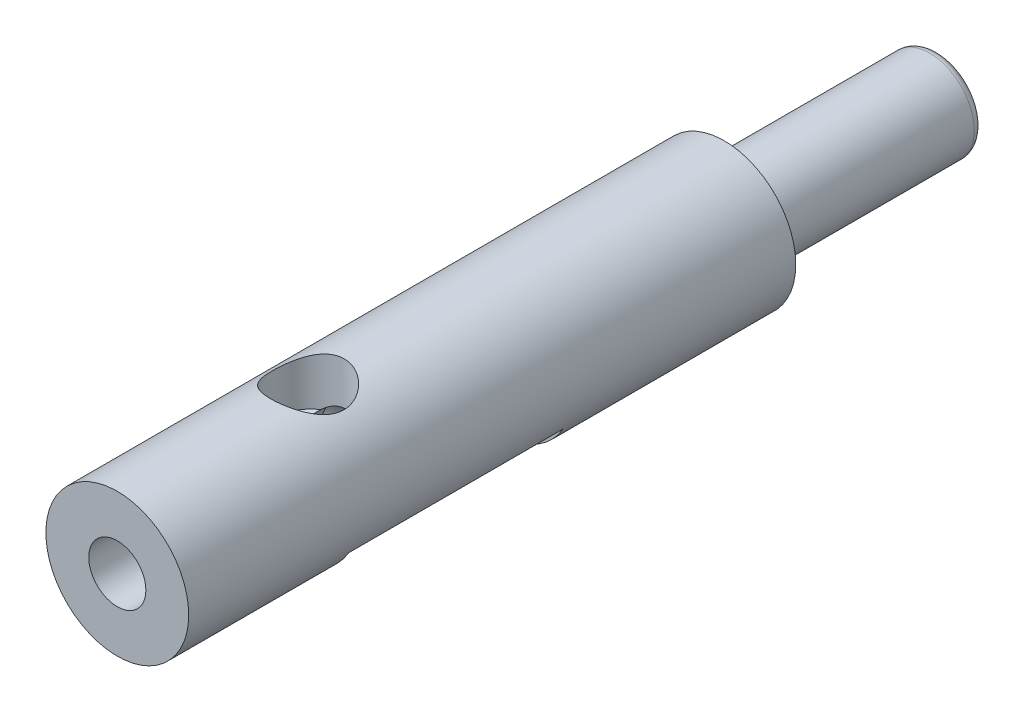
ISO-10303-21;
HEADER;
FILE_DESCRIPTION(('STEP AP214'),'2;1');
FILE_NAME('part.step','',(''),(''),'','','');
FILE_SCHEMA(('AUTOMOTIVE_DESIGN { 1 0 10303 214 1 1 1 1 }'));
ENDSEC;
DATA;
#1=APPLICATION_CONTEXT('core data for automotive mechanical design processes');
#2=APPLICATION_PROTOCOL_DEFINITION('international standard','automotive_design',2000,#1);
#3=PRODUCT_CONTEXT('',#1,'mechanical');
#4=PRODUCT('Part','Part','',(#3));
#5=PRODUCT_RELATED_PRODUCT_CATEGORY('part','',(#4));
#6=PRODUCT_DEFINITION_FORMATION('','',#4);
#7=PRODUCT_DEFINITION_CONTEXT('part definition',#1,'design');
#8=PRODUCT_DEFINITION('design','',#6,#7);
#9=PRODUCT_DEFINITION_SHAPE('','',#8);
#10=(LENGTH_UNIT() NAMED_UNIT(*) SI_UNIT(.MILLI.,.METRE.));
#11=(NAMED_UNIT(*) PLANE_ANGLE_UNIT() SI_UNIT($,.RADIAN.));
#12=(NAMED_UNIT(*) SI_UNIT($,.STERADIAN.) SOLID_ANGLE_UNIT());
#13=UNCERTAINTY_MEASURE_WITH_UNIT(LENGTH_MEASURE(1.E-05),#10,'distance_accuracy_value','');
#14=(GEOMETRIC_REPRESENTATION_CONTEXT(3) GLOBAL_UNCERTAINTY_ASSIGNED_CONTEXT((#13)) GLOBAL_UNIT_ASSIGNED_CONTEXT((#10,
#11,#12)) REPRESENTATION_CONTEXT('',''));
#15=CARTESIAN_POINT('',(0.,0.,0.));
#16=DIRECTION('',(0.,0.,1.));
#17=DIRECTION('',(1.,0.,0.));
#18=AXIS2_PLACEMENT_3D('',#15,#16,#17);
#19=CARTESIAN_POINT('',(0.,0.,34.));
#20=DIRECTION('',(0.,0.,-1.));
#21=DIRECTION('',(-1.,0.,0.));
#22=AXIS2_PLACEMENT_3D('',#19,#20,#21);
#23=CYLINDRICAL_SURFACE('',#22,4.);
#24=CARTESIAN_POINT('',(-2.087306520989,3.41220624925235,23.2180706735761));
#25=CARTESIAN_POINT('',(-2.0872983712268,3.41221670155995,23.1138574681017));
#26=CARTESIAN_POINT('',(-2.07923002755543,3.41718763218247,23.0095084970423));
#27=CARTESIAN_POINT('',(-2.04735396599089,3.43637381037194,22.8040154963455));
#28=CARTESIAN_POINT('',(-2.02351317468055,3.4506084821537,22.7028786703283));
#29=CARTESIAN_POINT('',(-1.96134726809038,3.4863135602557,22.5071675171292));
#30=CARTESIAN_POINT('',(-1.92309914656011,3.50774543930058,22.4125614147268));
#31=CARTESIAN_POINT('',(-1.83339662406273,3.55545068741429,22.2312222230999));
#32=CARTESIAN_POINT('',(-1.7819415086523,3.58172431838003,22.1444895601393));
#33=CARTESIAN_POINT('',(-1.66225835300388,3.63890679294312,21.9734592304427));
#34=CARTESIAN_POINT('',(-1.59299694545568,3.67001921005456,21.8899524059843));
#35=CARTESIAN_POINT('',(-1.44172635023534,3.7320382418743,21.7352538930055));
#36=CARTESIAN_POINT('',(-1.35971084235003,3.76294474658249,21.6640683473721));
#37=CARTESIAN_POINT('',(-1.17844129249509,3.82374232256527,21.5313363723876));
#38=CARTESIAN_POINT('',(-1.07839790515571,3.85342451512425,21.4707631381528));
#39=CARTESIAN_POINT('',(-0.867770689082845,3.90624222020305,21.367788966789));
#40=CARTESIAN_POINT('',(-0.757193566429018,3.92938186115206,21.3253765612253));
#41=CARTESIAN_POINT('',(-0.536938170470912,3.96525496500819,21.2630613510449));
#42=CARTESIAN_POINT('',(-0.427755786576409,3.97861171855394,21.241771620884));
#43=CARTESIAN_POINT('',(-0.20666856295669,3.99619271649832,21.2177384362071));
#44=CARTESIAN_POINT('',(-0.0947654116690164,4.00042248560961,21.2149837599798));
#45=CARTESIAN_POINT('',(0.118157243970995,3.99954887169315,21.2275640215212));
#46=CARTESIAN_POINT('',(0.219276967733855,3.99522512014094,21.2413467046197));
#47=CARTESIAN_POINT('',(0.417728547116217,3.97937355159008,21.2838323613842));
#48=CARTESIAN_POINT('',(0.51506011870552,3.9678451955017,21.3125364515282));
#49=CARTESIAN_POINT('',(0.704847633837912,3.93859693060396,21.384235805756));
#50=CARTESIAN_POINT('',(0.797217489815209,3.92079356572397,21.4274232999203));
#51=CARTESIAN_POINT('',(0.973738425838546,3.88072648833729,21.526597505979));
#52=CARTESIAN_POINT('',(1.05788654801115,3.85846117931458,21.5825888001808));
#53=CARTESIAN_POINT('',(1.22402901364951,3.80919310908805,21.7118613766422));
#54=CARTESIAN_POINT('',(1.3050678665134,3.78194147894561,21.7862767302281));
#55=CARTESIAN_POINT('',(1.45404618988851,3.72720558685101,21.9472501234364));
#56=CARTESIAN_POINT('',(1.52197558154635,3.6997211627337,22.0338174181242));
#57=CARTESIAN_POINT('',(1.64697526597734,3.64587402015667,22.2233670584243));
#58=CARTESIAN_POINT('',(1.70308202259202,3.61969337184873,22.3270427196845));
#59=CARTESIAN_POINT('',(1.79646893214262,3.5742723673565,22.5439460162941));
#60=CARTESIAN_POINT('',(1.83376873017324,3.55502477517245,22.6571635396112));
#61=CARTESIAN_POINT('',(1.88539718531143,3.5278989585284,22.8804996961417));
#62=CARTESIAN_POINT('',(1.90131196693337,3.51924063380393,22.9901529116632));
#63=CARTESIAN_POINT('',(1.91448120892429,3.51209795986849,23.2108733566092));
#64=CARTESIAN_POINT('',(1.91174885062291,3.51360642392704,23.3219395318157));
#65=CARTESIAN_POINT('',(1.88916366196273,3.52578792082786,23.5293785107335));
#66=CARTESIAN_POINT('',(1.87121635360817,3.53544038146758,23.6260295757919));
#67=CARTESIAN_POINT('',(1.82156131603793,3.56127668249863,23.8148062461181));
#68=CARTESIAN_POINT('',(1.78984913056562,3.57746263793186,23.9069303750696));
#69=CARTESIAN_POINT('',(1.71205553864392,3.61535784764623,24.0888933353812));
#70=CARTESIAN_POINT('',(1.66537664439615,3.63728819422939,24.1784287072821));
#71=CARTESIAN_POINT('',(1.55954494017103,3.68390575019848,24.3490092166551));
#72=CARTESIAN_POINT('',(1.50038572241251,3.70859437269297,24.4300499606066));
#73=CARTESIAN_POINT('',(1.36260986131546,3.76156831368948,24.5920282086187));
#74=CARTESIAN_POINT('',(1.28248054462416,3.789914715202,24.6716649749939));
#75=CARTESIAN_POINT('',(1.10956764701506,3.84409507348772,24.8168951495808));
#76=CARTESIAN_POINT('',(1.01677980889261,3.86992817998254,24.8824838141029));
#77=CARTESIAN_POINT('',(0.817888015880839,3.91685551043492,24.9992181254088));
#78=CARTESIAN_POINT('',(0.7114972535076,3.93780667297594,25.0499369097429));
#79=CARTESIAN_POINT('',(0.490371655694362,3.9713975347904,25.1323464815457));
#80=CARTESIAN_POINT('',(0.375644246727311,3.98404453318746,25.1640539772602));
#81=CARTESIAN_POINT('',(0.152488984801932,3.9985107224727,25.2048078010612));
#82=CARTESIAN_POINT('',(0.0444489709357373,4.00121692503581,25.2156664222404));
#83=CARTESIAN_POINT('',(-0.171808066243468,3.99776924021965,25.2197572075718));
#84=CARTESIAN_POINT('',(-0.280025014333122,3.99161845477272,25.212995542105));
#85=CARTESIAN_POINT('',(-0.486069441482088,3.9716186914946,25.1832378492597));
#86=CARTESIAN_POINT('',(-0.584111642320847,3.95830368918597,25.161340936267));
#87=CARTESIAN_POINT('',(-0.774805870422456,3.92543547416609,25.1034167137694));
#88=CARTESIAN_POINT('',(-0.867457122508597,3.90588136692796,25.0673873778692));
#89=CARTESIAN_POINT('',(-1.0492164483741,3.86112438052189,24.9806164185847));
#90=CARTESIAN_POINT('',(-1.13800349172459,3.83571567169725,24.9293114538242));
#91=CARTESIAN_POINT('',(-1.30598819718358,3.78182360539443,24.814155385458));
#92=CARTESIAN_POINT('',(-1.38518142783417,3.75333883846369,24.7502985194745));
#93=CARTESIAN_POINT('',(-1.54007901419964,3.69266097382539,24.6044740380167));
#94=CARTESIAN_POINT('',(-1.61465180519123,3.66038094312952,24.5213364927758));
#95=CARTESIAN_POINT('',(-1.7492402441652,3.59800939475425,24.34317844527));
#96=CARTESIAN_POINT('',(-1.80924301388893,3.56791982952679,24.2481475422156));
#97=CARTESIAN_POINT('',(-1.91466471399722,3.51251209241111,24.0447617794458));
#98=CARTESIAN_POINT('',(-1.95956284374328,3.48737475548029,23.9360807628408));
#99=CARTESIAN_POINT('',(-2.0123785299673,3.45698362194022,23.7674925539451));
#100=CARTESIAN_POINT('',(-2.02755465920031,3.44807715095049,23.7104228529854));
#101=CARTESIAN_POINT('',(-2.05290522088791,3.43304537127563,23.5948381160759));
#102=CARTESIAN_POINT('',(-2.06308315034967,3.42691811833116,23.5363241208218));
#103=CARTESIAN_POINT('',(-2.076204225627,3.4189789339713,23.4344698843288));
#104=CARTESIAN_POINT('',(-2.08036285182793,3.41644619338253,23.391337616326));
#105=CARTESIAN_POINT('',(-2.08591578873495,3.41305761878474,23.3048349804832));
#106=CARTESIAN_POINT('',(-2.08730991451436,3.41220189695715,23.2614645969094));
#107=CARTESIAN_POINT('',(-2.087306520989,3.41220624925235,23.2180706735761));
#108=B_SPLINE_CURVE_WITH_KNOTS('',3,(#24,#25,#26,#27,#28,#29,#30,#31,#32,#33,#34,#35,#36,#37,
#38,#39,#40,#41,#42,#43,#44,#45,#46,#47,#48,#49,#50,#51,#52,#53,#54,#55,#56,#57,#58,#59,#60,#61,
#62,#63,#64,#65,#66,#67,#68,#69,#70,#71,#72,#73,#74,#75,#76,#77,#78,#79,#80,#81,#82,#83,#84,#85,
#86,#87,#88,#89,#90,#91,#92,#93,#94,#95,#96,#97,#98,#99,#100,#101,#102,#103,#104,#105,#106,
#107),.UNSPECIFIED.,.T.,.F.,(4,2,2,2,2,2,2,2,2,2,2,2,2,2,2,2,2,2,2,2,2,2,2,2,2,2,2,2,2,2,2,2,2,
2,2,2,2,2,2,2,2,4),(0.,0.312464245189427,0.625585785649606,0.937057191861533,1.24854545093096,
1.58572462503712,1.92307142172808,2.28315784481592,2.64301653931847,2.97726969939936,
3.31132047376145,3.61632194973142,3.92134625038975,4.23059069466358,4.53994598704609,
4.87854382917846,5.21740096495901,5.57777683462961,5.93777548427474,6.26924581712487,
6.6004818638081,6.89548366852115,7.1905810487619,7.49934592816239,7.80826972444158,
8.1561348716529,8.50411729960468,8.86128362829995,9.21813559621607,9.54224540783037,
9.86624173592006,10.1688884974705,10.4715786702809,10.7872150144301,11.102996602055,
11.450204837042,11.7977188569437,12.1562149808127,12.3351395323571,12.5139387197525,
12.6440387634035,12.7741475095881),.UNSPECIFIED.);
#109=CARTESIAN_POINT('',(-2.087306520989,3.41220624925235,23.2180706735761));
#110=VERTEX_POINT('',#109);
#111=EDGE_CURVE('E91',#110,#110,#108,.T.);
#112=ORIENTED_EDGE('',*,*,#111,.T.);
#113=EDGE_LOOP('',(#112));
#114=FACE_BOUND('',#113,.T.);
#115=CARTESIAN_POINT('',(0.,0.,34.));
#116=DIRECTION('',(0.,0.,1.));
#117=DIRECTION('',(1.,0.,0.));
#118=AXIS2_PLACEMENT_3D('',#115,#116,#117);
#119=CIRCLE('',#118,4.);
#120=CARTESIAN_POINT('',(4.,0.,34.));
#121=VERTEX_POINT('',#120);
#122=EDGE_CURVE('E159',#121,#121,#119,.T.);
#123=ORIENTED_EDGE('',*,*,#122,.F.);
#124=EDGE_LOOP('',(#123));
#125=FACE_BOUND('',#124,.T.);
#126=CARTESIAN_POINT('',(0.,0.,0.));
#127=DIRECTION('',(0.,0.,1.));
#128=DIRECTION('',(1.,0.,0.));
#129=AXIS2_PLACEMENT_3D('',#126,#127,#128);
#130=CIRCLE('',#129,4.);
#131=CARTESIAN_POINT('',(4.,0.,0.));
#132=VERTEX_POINT('',#131);
#133=EDGE_CURVE('E164',#132,#132,#130,.T.);
#134=ORIENTED_EDGE('',*,*,#133,.T.);
#135=EDGE_LOOP('',(#134));
#136=FACE_BOUND('',#135,.T.);
#137=CARTESIAN_POINT('',(0.,0.,12.5));
#138=DIRECTION('',(0.,0.,1.));
#139=DIRECTION('',(1.,0.,0.));
#140=AXIS2_PLACEMENT_3D('',#137,#138,#139);
#141=CIRCLE('',#140,4.);
#142=CARTESIAN_POINT('',(-3.46410161513775,-2.,12.5));
#143=VERTEX_POINT('',#142);
#144=CARTESIAN_POINT('',(3.46410161513775,-2.,12.5));
#145=VERTEX_POINT('',#144);
#146=EDGE_CURVE('E158',#143,#145,#141,.T.);
#147=ORIENTED_EDGE('',*,*,#146,.F.);
#148=DIRECTION('',(0.,0.,-1.));
#149=VECTOR('',#148,1.);
#150=CARTESIAN_POINT('',(-3.46410161513775,-2.,34.));
#151=LINE('',#150,#149);
#152=CARTESIAN_POINT('',(-3.46410161513775,-2.,24.5));
#153=VERTEX_POINT('',#152);
#154=EDGE_CURVE('E172',#153,#143,#151,.T.);
#155=ORIENTED_EDGE('',*,*,#154,.F.);
#156=CARTESIAN_POINT('',(0.,0.,24.5));
#157=DIRECTION('',(0.,0.,-1.));
#158=DIRECTION('',(-1.,0.,0.));
#159=AXIS2_PLACEMENT_3D('',#156,#157,#158);
#160=CIRCLE('',#159,4.);
#161=CARTESIAN_POINT('',(3.46410161513775,-2.,24.5));
#162=VERTEX_POINT('',#161);
#163=EDGE_CURVE('E170',#162,#153,#160,.T.);
#164=ORIENTED_EDGE('',*,*,#163,.F.);
#165=DIRECTION('',(0.,0.,-1.));
#166=VECTOR('',#165,1.);
#167=CARTESIAN_POINT('',(3.46410161513775,-2.,34.));
#168=LINE('',#167,#166);
#169=EDGE_CURVE('E161',#145,#162,#168,.F.);
#170=ORIENTED_EDGE('',*,*,#169,.F.);
#171=EDGE_LOOP('',(#147,#155,#164,#170));
#172=FACE_BOUND('',#171,.T.);
#173=ADVANCED_FACE('F37',(#114,#125,#136,#172),#23,.T.);
#174=CARTESIAN_POINT('',(0.,0.,-12.));
#175=DIRECTION('',(0.,0.,1.));
#176=DIRECTION('',(1.,0.,0.));
#177=AXIS2_PLACEMENT_3D('',#174,#175,#176);
#178=CYLINDRICAL_SURFACE('',#177,2.5);
#179=CARTESIAN_POINT('',(0.,0.,-11.5));
#180=DIRECTION('',(0.,0.,1.));
#181=DIRECTION('',(1.,0.,0.));
#182=AXIS2_PLACEMENT_3D('',#179,#180,#181);
#183=CIRCLE('',#182,2.5);
#184=CARTESIAN_POINT('',(2.5,0.,-11.5));
#185=VERTEX_POINT('',#184);
#186=EDGE_CURVE('E45',#185,#185,#183,.T.);
#187=ORIENTED_EDGE('',*,*,#186,.T.);
#188=EDGE_LOOP('',(#187));
#189=FACE_BOUND('',#188,.T.);
#190=CARTESIAN_POINT('',(0.,0.,0.));
#191=DIRECTION('',(0.,0.,1.));
#192=DIRECTION('',(1.,0.,0.));
#193=AXIS2_PLACEMENT_3D('',#190,#191,#192);
#194=CIRCLE('',#193,2.5);
#195=CARTESIAN_POINT('',(2.5,0.,0.));
#196=VERTEX_POINT('',#195);
#197=EDGE_CURVE('E156',#196,#196,#194,.T.);
#198=ORIENTED_EDGE('',*,*,#197,.F.);
#199=EDGE_LOOP('',(#198));
#200=FACE_BOUND('',#199,.T.);
#201=ADVANCED_FACE('F139',(#189,#200),#178,.T.);
#202=CARTESIAN_POINT('',(0.,0.,-12.));
#203=DIRECTION('',(0.,0.,1.));
#204=DIRECTION('',(1.,0.,0.));
#205=AXIS2_PLACEMENT_3D('',#202,#203,#204);
#206=PLANE('',#205);
#207=CARTESIAN_POINT('',(0.,0.,-12.));
#208=DIRECTION('',(0.,0.,1.));
#209=DIRECTION('',(1.,0.,0.));
#210=AXIS2_PLACEMENT_3D('',#207,#208,#209);
#211=CIRCLE('',#210,2.);
#212=CARTESIAN_POINT('',(2.,0.,-12.));
#213=VERTEX_POINT('',#212);
#214=EDGE_CURVE('E11',#213,#213,#211,.F.);
#215=ORIENTED_EDGE('',*,*,#214,.T.);
#216=EDGE_LOOP('',(#215));
#217=FACE_BOUND('',#216,.T.);
#218=ADVANCED_FACE('F143',(#217),#206,.F.);
#219=CARTESIAN_POINT('',(0.,0.,34.));
#220=DIRECTION('',(0.,0.,1.));
#221=DIRECTION('',(1.,0.,0.));
#222=AXIS2_PLACEMENT_3D('',#219,#220,#221);
#223=PLANE('',#222);
#224=CARTESIAN_POINT('',(0.,0.,34.));
#225=DIRECTION('',(0.,0.,1.));
#226=DIRECTION('',(1.,0.,0.));
#227=AXIS2_PLACEMENT_3D('',#224,#225,#226);
#228=CIRCLE('',#227,1.6);
#229=CARTESIAN_POINT('',(1.6,0.,34.));
#230=VERTEX_POINT('',#229);
#231=EDGE_CURVE('E188',#230,#230,#228,.T.);
#232=ORIENTED_EDGE('',*,*,#231,.F.);
#233=EDGE_LOOP('',(#232));
#234=FACE_BOUND('',#233,.T.);
#235=ORIENTED_EDGE('',*,*,#122,.T.);
#236=EDGE_LOOP('',(#235));
#237=FACE_BOUND('',#236,.T.);
#238=ADVANCED_FACE('F145',(#234,#237),#223,.T.);
#239=CARTESIAN_POINT('',(0.,0.,0.));
#240=DIRECTION('',(0.,0.,1.));
#241=DIRECTION('',(1.,0.,0.));
#242=AXIS2_PLACEMENT_3D('',#239,#240,#241);
#243=PLANE('',#242);
#244=ORIENTED_EDGE('',*,*,#197,.T.);
#245=EDGE_LOOP('',(#244));
#246=FACE_BOUND('',#245,.T.);
#247=ORIENTED_EDGE('',*,*,#133,.F.);
#248=EDGE_LOOP('',(#247));
#249=FACE_BOUND('',#248,.T.);
#250=ADVANCED_FACE('F141',(#246,#249),#243,.F.);
#251=CARTESIAN_POINT('',(0.,0.,20.9613769904441));
#252=DIRECTION('',(0.,0.,1.));
#253=DIRECTION('',(1.,0.,0.));
#254=AXIS2_PLACEMENT_3D('',#251,#252,#253);
#255=CONICAL_SURFACE('',#254,1.6,1.02974425867665);
#256=CARTESIAN_POINT('',(0.,0.,20.));
#257=VERTEX_POINT('',#256);
#258=VERTEX_LOOP('',#257);
#259=FACE_BOUND('',#258,.T.);
#260=CARTESIAN_POINT('',(0.,0.,20.9613769904441));
#261=DIRECTION('',(0.,0.,1.));
#262=DIRECTION('',(1.,0.,0.));
#263=AXIS2_PLACEMENT_3D('',#260,#261,#262);
#264=CIRCLE('',#263,1.6);
#265=CARTESIAN_POINT('',(1.6,0.,20.9613769904441));
#266=VERTEX_POINT('',#265);
#267=EDGE_CURVE('E192',#266,#266,#264,.T.);
#268=ORIENTED_EDGE('',*,*,#267,.T.);
#269=EDGE_LOOP('',(#268));
#270=FACE_BOUND('',#269,.T.);
#271=ADVANCED_FACE('F201',(#259,#270),#255,.F.);
#272=CARTESIAN_POINT('',(0.,0.,34.));
#273=DIRECTION('',(0.,0.,1.));
#274=DIRECTION('',(1.,0.,0.));
#275=AXIS2_PLACEMENT_3D('',#272,#273,#274);
#276=CYLINDRICAL_SURFACE('',#275,1.6);
#277=CARTESIAN_POINT('',(-1.08651599932255,1.17451393487524,24.9163444836529));
#278=CARTESIAN_POINT('',(-1.0574450062128,1.20139972940264,24.9348446340412));
#279=CARTESIAN_POINT('',(-1.02725259762029,1.22733330121804,24.9529444337414));
#280=CARTESIAN_POINT('',(-0.964600552337286,1.27716685694111,24.9880888976747));
#281=CARTESIAN_POINT('',(-0.932138678134869,1.30106478087727,25.005132488437));
#282=CARTESIAN_POINT('',(-0.830856202992295,1.36980388181825,25.0545082706596));
#283=CARTESIAN_POINT('',(-0.758612413888538,1.41124687315958,25.0847748994649));
#284=CARTESIAN_POINT('',(-0.605636948866268,1.48337294676583,25.137536279422));
#285=CARTESIAN_POINT('',(-0.524854473118135,1.51398630853948,25.159980658194));
#286=CARTESIAN_POINT('',(-0.357617952014152,1.5619270198345,25.194506714535));
#287=CARTESIAN_POINT('',(-0.271190679007864,1.57931275181337,25.2066339569629));
#288=CARTESIAN_POINT('',(-0.107969018111607,1.59816777077223,25.2183822410082));
#289=CARTESIAN_POINT('',(-0.031493291198824,1.60150405615408,25.2194995241141));
#290=CARTESIAN_POINT('',(0.120803842161671,1.5972493921442,25.213006560494));
#291=CARTESIAN_POINT('',(0.196625064462278,1.58965546222705,25.2053939333519));
#292=CARTESIAN_POINT('',(0.339812507052802,1.56506518797106,25.1829779620891));
#293=CARTESIAN_POINT('',(0.407394334374552,1.54878559254196,25.1687321356931));
#294=CARTESIAN_POINT('',(0.538589672950616,1.50819237151349,25.1343033164989));
#295=CARTESIAN_POINT('',(0.602196969461207,1.48386652060961,25.1141112943344));
#296=CARTESIAN_POINT('',(0.730144496698211,1.4255848673013,25.0668686244947));
#297=CARTESIAN_POINT('',(0.793992718522036,1.39093930195688,25.0393519912256));
#298=CARTESIAN_POINT('',(0.914873772212032,1.3145690499855,24.9803974618087));
#299=CARTESIAN_POINT('',(0.971936862516863,1.27287796787016,24.9489783592238));
#300=CARTESIAN_POINT('',(1.02549418831531,1.22815376469379,24.9163444836529));
#301=B_SPLINE_CURVE_WITH_KNOTS('',3,(#277,#278,#279,#280,#281,#282,#283,#284,#285,#286,#287,
#288,#289,#290,#291,#292,#293,#294,#295,#296,#297,#298,#299,#300),.UNSPECIFIED.,.F.,.F.,(4,2,2,
2,2,2,2,2,2,2,2,4),(0.,0.131065833325743,0.262262760768412,0.526792599849854,0.792995733481469,
1.05801700573743,1.28642664891346,1.51489858818507,1.72691166385949,1.93924835869897,
2.17152332780728,2.40272018063616),.UNSPECIFIED.);
#302=CARTESIAN_POINT('',(-1.08651599932255,1.17451393487524,24.9163444836529));
#303=VERTEX_POINT('',#302);
#304=CARTESIAN_POINT('',(1.02549418831531,1.22815376469379,24.9163444836529));
#305=VERTEX_POINT('',#304);
#306=EDGE_CURVE('E85',#303,#305,#301,.T.);
#307=ORIENTED_EDGE('',*,*,#306,.T.);
#308=CARTESIAN_POINT('',(0.813896950511766,1.37752377618234,25.3099508963013));
#309=CARTESIAN_POINT('',(0.835684754105811,1.3646454012153,25.277127816322));
#310=CARTESIAN_POINT('',(0.856535840829531,1.35163386153777,25.2437540866797));
#311=CARTESIAN_POINT('',(0.896508646365662,1.32546065057639,25.1760646506786));
#312=CARTESIAN_POINT('',(0.915631154503694,1.31229905093841,25.1417493836836));
#313=CARTESIAN_POINT('',(0.97058270034513,1.27279391584384,25.0377120004932));
#314=CARTESIAN_POINT('',(1.00407489324304,1.24638178267578,24.9667763016348));
#315=CARTESIAN_POINT('',(1.06600735669848,1.19385582938385,24.8216288781987));
#316=CARTESIAN_POINT('',(1.09438761795337,1.16774854524359,24.7473895866469));
#317=CARTESIAN_POINT('',(1.14627062779237,1.11686315577126,24.5967294167239));
#318=CARTESIAN_POINT('',(1.16977022734626,1.09208591618799,24.5203071658384));
#319=CARTESIAN_POINT('',(1.21429755547057,1.04244676849281,24.3581972468003));
#320=CARTESIAN_POINT('',(1.23487738441595,1.01780109008953,24.272319824443));
#321=CARTESIAN_POINT('',(1.27094779172304,0.972384878988584,24.0984956932161));
#322=CARTESIAN_POINT('',(1.2864390619973,0.951613819608928,24.0105492674216));
#323=CARTESIAN_POINT('',(1.31235094924013,0.915547252691032,23.8334549027249));
#324=CARTESIAN_POINT('',(1.32280743950715,0.900213218919697,23.7443202593327));
#325=CARTESIAN_POINT('',(1.33878858258304,0.876273937793015,23.564710300569));
#326=CARTESIAN_POINT('',(1.34431459483023,0.867666835759861,23.4742353617443));
#327=CARTESIAN_POINT('',(1.35046338940171,0.858071232905594,23.2900314774173));
#328=CARTESIAN_POINT('',(1.35093761153717,0.857313581686129,23.1962849207876));
#329=CARTESIAN_POINT('',(1.34658791498628,0.864126522796806,23.0092255110794));
#330=CARTESIAN_POINT('',(1.34176356818131,0.871697788094448,22.9159126936584));
#331=CARTESIAN_POINT('',(1.32682149050122,0.89427325297329,22.7298648334405));
#332=CARTESIAN_POINT('',(1.31666031366435,0.909338404576794,22.6371409506221));
#333=CARTESIAN_POINT('',(1.29105221332277,0.9453409135966,22.4535577346076));
#334=CARTESIAN_POINT('',(1.27560206257737,0.966281854908197,22.3626995758084));
#335=CARTESIAN_POINT('',(1.23655852588749,1.01590606908578,22.1695192556068));
#336=CARTESIAN_POINT('',(1.21208400419071,1.04528248620941,22.0675552744232));
#337=CARTESIAN_POINT('',(1.15550459500906,1.10751202721758,21.8669195024903));
#338=CARTESIAN_POINT('',(1.12340481052848,1.14036281784818,21.7682455601163));
#339=CARTESIAN_POINT('',(1.06902689673147,1.19070532400458,21.6238022193954));
#340=CARTESIAN_POINT('',(1.05001371662418,1.2075451105674,21.576560380875));
#341=CARTESIAN_POINT('',(1.00970085431732,1.24144976270906,21.4831532670331));
#342=CARTESIAN_POINT('',(0.988401712659669,1.25851457424468,21.4369877403343));
#343=CARTESIAN_POINT('',(0.943252582616046,1.29270311528965,21.3458124117063));
#344=CARTESIAN_POINT('',(0.919397843467871,1.30982689518367,21.3008049620983));
#345=CARTESIAN_POINT('',(0.868849908781409,1.34388182276737,21.2122898775916));
#346=CARTESIAN_POINT('',(0.842154462776655,1.36081280578738,21.1687834685254));
#347=CARTESIAN_POINT('',(0.813896950511767,1.37752377618234,21.1261904508508));
#348=B_SPLINE_CURVE_WITH_KNOTS('',3,(#308,#309,#310,#311,#312,#313,#314,#315,#316,#317,#318,
#319,#320,#321,#322,#323,#324,#325,#326,#327,#328,#329,#330,#331,#332,#333,#334,#335,#336,#337,
#338,#339,#340,#341,#342,#343,#344,#345,#346,#347),.UNSPECIFIED.,.F.,.F.,(4,2,2,2,2,2,2,2,2,2,2,
2,2,2,2,2,2,2,2,4),(0.,0.12430513626386,0.248553220927301,0.496591396049362,0.747374507109368,
0.998318925590059,1.27313878817505,1.54792126687426,1.82071580683893,2.09343510824661,
2.37415299073942,2.65489355660143,2.93795582683448,3.22119112556449,3.54750485171948,
3.87360081326931,4.03446213820394,4.19528550908323,4.35641321012168,4.51766952380812),.UNSPECIFIED.);
#349=CARTESIAN_POINT('',(1.02549418831531,1.22815376469379,21.5197968634993));
#350=VERTEX_POINT('',#349);
#351=EDGE_CURVE('E78',#305,#350,#348,.T.);
#352=ORIENTED_EDGE('',*,*,#351,.T.);
#353=CARTESIAN_POINT('',(1.02549418831531,1.22815376469379,21.5197968634993));
#354=CARTESIAN_POINT('',(0.99509588970117,1.25352918644639,21.501296713111));
#355=CARTESIAN_POINT('',(0.963625958394145,1.27789668749291,21.4831969134108));
#356=CARTESIAN_POINT('',(0.898525020285657,1.32448563373066,21.4480524494775));
#357=CARTESIAN_POINT('',(0.864891883425859,1.34670490802489,21.4310088587152));
#358=CARTESIAN_POINT('',(0.760250630180689,1.41021405609396,21.3816330764926));
#359=CARTESIAN_POINT('',(0.685996238669008,1.44793635635012,21.3513664476872));
#360=CARTESIAN_POINT('',(0.529556709513211,1.51220405515867,21.2986050677302));
#361=CARTESIAN_POINT('',(0.447324376705328,1.53867724438958,21.2761606889582));
#362=CARTESIAN_POINT('',(0.277869882083926,1.57806683747,21.2416346326172));
#363=CARTESIAN_POINT('',(0.190671494475959,1.59104290753435,21.2295073901893));
#364=CARTESIAN_POINT('',(0.0267031407403773,1.60158811018366,21.217759106144));
#365=CARTESIAN_POINT('',(-0.0498433483817377,1.60103801013299,21.2166418230381));
#366=CARTESIAN_POINT('',(-0.201728158111184,1.58905787786698,21.2231347866582));
#367=CARTESIAN_POINT('',(-0.277066143510481,1.57762487831655,21.2307474138003));
#368=CARTESIAN_POINT('',(-0.418820724570601,1.5457977821237,21.2531633850631));
#369=CARTESIAN_POINT('',(-0.48548903312145,1.526108565622,21.2674092114591));
#370=CARTESIAN_POINT('',(-0.614454624365648,1.47890790108654,21.3018380306533));
#371=CARTESIAN_POINT('',(-0.676745079742918,1.45138455898431,21.3220300528178));
#372=CARTESIAN_POINT('',(-0.801569141252793,1.38668313313764,21.3692727226575));
#373=CARTESIAN_POINT('',(-0.863576358842128,1.34884115122696,21.3967893559266));
#374=CARTESIAN_POINT('',(-0.98042483820186,1.26643315769057,21.4557438853435));
#375=CARTESIAN_POINT('',(-1.03529802524309,1.22189917126421,21.4871629879284));
#376=CARTESIAN_POINT('',(-1.08651599932255,1.17451393487524,21.5197968634993));
#377=B_SPLINE_CURVE_WITH_KNOTS('',3,(#353,#354,#355,#356,#357,#358,#359,#360,#361,#362,#363,
#364,#365,#366,#367,#368,#369,#370,#371,#372,#373,#374,#375,#376),.UNSPECIFIED.,.F.,.F.,(4,2,2,
2,2,2,2,2,2,2,2,4),(0.,0.131065833325743,0.262262760768412,0.526792599849853,0.792995733481468,
1.05801700573743,1.28642664891346,1.51489858818507,1.72691166385949,1.93924835869897,
2.17152332780728,2.40272018063616),.UNSPECIFIED.);
#378=CARTESIAN_POINT('',(-1.08651599932255,1.17451393487524,21.5197968634993));
#379=VERTEX_POINT('',#378);
#380=EDGE_CURVE('E90',#350,#379,#377,.T.);
#381=ORIENTED_EDGE('',*,*,#380,.T.);
#382=CARTESIAN_POINT('',(-0.813896950511766,1.37752377618234,21.026024711034));
#383=CARTESIAN_POINT('',(-0.834961691593683,1.36507312947157,21.0546586437949));
#384=CARTESIAN_POINT('',(-0.855160377368341,1.35249207147262,21.0838532155904));
#385=CARTESIAN_POINT('',(-0.893959294637032,1.32716842438204,21.1431953315899));
#386=CARTESIAN_POINT('',(-0.912560370054487,1.31442592470388,21.17334236101));
#387=CARTESIAN_POINT('',(-0.966114812899568,1.27614547237127,21.2648618229746));
#388=CARTESIAN_POINT('',(-0.998917768879572,1.25049472763822,21.3274496837881));
#389=CARTESIAN_POINT('',(-1.0598519022021,1.19929454851713,21.4555608038681));
#390=CARTESIAN_POINT('',(-1.08794333540161,1.17374759295934,21.5211036411758));
#391=CARTESIAN_POINT('',(-1.13978710900466,1.12347182749514,21.6542472889137));
#392=CARTESIAN_POINT('',(-1.16353577976262,1.09874372383589,21.7218497840085));
#393=CARTESIAN_POINT('',(-1.21492456456994,1.04206474780392,21.8832682336202));
#394=CARTESIAN_POINT('',(-1.24091990405818,1.01069273067465,21.9778142327773));
#395=CARTESIAN_POINT('',(-1.28647573376217,0.952027649114481,22.1696955105059));
#396=CARTESIAN_POINT('',(-1.30603544953896,0.924735075804131,22.2670311232383));
#397=CARTESIAN_POINT('',(-1.33903549762768,0.876264563751593,22.4636640500181));
#398=CARTESIAN_POINT('',(-1.35250970541599,0.855053022051806,22.5629472119851));
#399=CARTESIAN_POINT('',(-1.37364470344028,0.820680291261176,22.7634948235483));
#400=CARTESIAN_POINT('',(-1.38130945550291,0.807513617068458,22.8647578745062));
#401=CARTESIAN_POINT('',(-1.38993527632543,0.79255108970131,23.0490006444562));
#402=CARTESIAN_POINT('',(-1.39189368516298,0.789069530106689,23.1317967996564));
#403=CARTESIAN_POINT('',(-1.39199994820608,0.788883649786435,23.2973981884286));
#404=CARTESIAN_POINT('',(-1.39014803330497,0.792178918406825,23.3802034211466));
#405=CARTESIAN_POINT('',(-1.38262552975018,0.805233597811245,23.5454837837891));
#406=CARTESIAN_POINT('',(-1.37693798914792,0.815021701196351,23.6279558062621));
#407=CARTESIAN_POINT('',(-1.36172807162243,0.840184693733319,23.7916799932988));
#408=CARTESIAN_POINT('',(-1.3522047658606,0.855560935976576,23.8729318574519));
#409=CARTESIAN_POINT('',(-1.32606011228904,0.895704730895698,24.0564522399063));
#410=CARTESIAN_POINT('',(-1.30819761360466,0.92189649702156,24.1582307417745));
#411=CARTESIAN_POINT('',(-1.26575842807826,0.97935317013598,24.3589646031357));
#412=CARTESIAN_POINT('',(-1.24117710942297,1.01062157078998,24.4579179628688));
#413=CARTESIAN_POINT('',(-1.18472145983894,1.07624596854049,24.6522022896893));
#414=CARTESIAN_POINT('',(-1.15287662680193,1.11058914501782,24.7475461375885));
#415=CARTESIAN_POINT('',(-1.08072102442061,1.18092596814658,24.9342608072921));
#416=CARTESIAN_POINT('',(-1.04042111628601,1.21691745149322,25.0256365464199));
#417=CARTESIAN_POINT('',(-0.968631595050683,1.27392562451809,25.1657789745872));
#418=CARTESIAN_POINT('',(-0.940556464906798,1.29487923245095,25.2163147328701));
#419=CARTESIAN_POINT('',(-0.880381755571367,1.33650518895293,25.3150853456243));
#420=CARTESIAN_POINT('',(-0.848279847698159,1.35717736704077,25.3633188462388));
#421=CARTESIAN_POINT('',(-0.813896950511766,1.37752377618234,25.4101166361181));
#422=B_SPLINE_CURVE_WITH_KNOTS('',3,(#382,#383,#384,#385,#386,#387,#388,#389,#390,#391,#392,
#393,#394,#395,#396,#397,#398,#399,#400,#401,#402,#403,#404,#405,#406,#407,#408,#409,#410,#411,
#412,#413,#414,#415,#416,#417,#418,#419,#420,#421),.UNSPECIFIED.,.F.,.F.,(4,2,2,2,2,2,2,2,2,2,2,
2,2,2,2,2,2,2,2,4),(0.,0.112956722104783,0.225853404062722,0.451111847676657,0.678184081440371,
0.905447314014163,1.21396994728924,1.5225296934608,1.82934998180227,2.13596084170853,
2.38428831310167,2.63260073709278,2.88201785898293,3.13149541409912,3.4508728487027,
3.77047101313449,4.08879366357472,4.40670988009408,4.59102637152695,4.77544994870963),.UNSPECIFIED.);
#423=EDGE_CURVE('E95',#379,#303,#422,.T.);
#424=ORIENTED_EDGE('',*,*,#423,.T.);
#425=EDGE_LOOP('',(#307,#352,#381,#424));
#426=FACE_BOUND('',#425,.T.);
#427=ORIENTED_EDGE('',*,*,#267,.F.);
#428=EDGE_LOOP('',(#427));
#429=FACE_BOUND('',#428,.T.);
#430=ORIENTED_EDGE('',*,*,#231,.T.);
#431=EDGE_LOOP('',(#430));
#432=FACE_BOUND('',#431,.T.);
#433=ADVANCED_FACE('F93',(#426,#429,#432),#276,.F.);
#434=CARTESIAN_POINT('',(-4.,0.,24.5));
#435=DIRECTION('',(0.,0.,-1.));
#436=DIRECTION('',(-1.,0.,0.));
#437=AXIS2_PLACEMENT_3D('',#434,#435,#436);
#438=PLANE('',#437);
#439=DIRECTION('',(1.,0.,0.));
#440=VECTOR('',#439,1.);
#441=CARTESIAN_POINT('',(-4.,-2.,24.5));
#442=LINE('',#441,#440);
#443=EDGE_CURVE('E133',#153,#162,#442,.T.);
#444=ORIENTED_EDGE('',*,*,#443,.T.);
#445=ORIENTED_EDGE('',*,*,#163,.T.);
#446=EDGE_LOOP('',(#444,#445));
#447=FACE_BOUND('',#446,.T.);
#448=ADVANCED_FACE('F215',(#447),#438,.T.);
#449=CARTESIAN_POINT('',(-4.,-2.,0.));
#450=DIRECTION('',(0.,-1.,0.));
#451=DIRECTION('',(0.,0.,-1.));
#452=AXIS2_PLACEMENT_3D('',#449,#450,#451);
#453=PLANE('',#452);
#454=ORIENTED_EDGE('',*,*,#154,.T.);
#455=DIRECTION('',(1.,0.,0.));
#456=VECTOR('',#455,1.);
#457=CARTESIAN_POINT('',(-4.,-2.,12.5));
#458=LINE('',#457,#456);
#459=EDGE_CURVE('E132',#143,#145,#458,.T.);
#460=ORIENTED_EDGE('',*,*,#459,.T.);
#461=ORIENTED_EDGE('',*,*,#169,.T.);
#462=ORIENTED_EDGE('',*,*,#443,.F.);
#463=EDGE_LOOP('',(#454,#460,#461,#462));
#464=FACE_BOUND('',#463,.T.);
#465=ADVANCED_FACE('F183',(#464),#453,.T.);
#466=CARTESIAN_POINT('',(-4.,0.,12.5));
#467=DIRECTION('',(0.,0.,1.));
#468=DIRECTION('',(1.,0.,0.));
#469=AXIS2_PLACEMENT_3D('',#466,#467,#468);
#470=PLANE('',#469);
#471=ORIENTED_EDGE('',*,*,#459,.F.);
#472=ORIENTED_EDGE('',*,*,#146,.T.);
#473=EDGE_LOOP('',(#471,#472));
#474=FACE_BOUND('',#473,.T.);
#475=ADVANCED_FACE('F119',(#474),#470,.T.);
#476=CARTESIAN_POINT('',(-0.101557348035221,3.99871055529905,23.2180706735761));
#477=DIRECTION('',(-0.0253893370088051,0.999677638824763,0.));
#478=DIRECTION('',(-0.999677638824763,-0.0253893370088051,0.));
#479=AXIS2_PLACEMENT_3D('',#476,#477,#478);
#480=CYLINDRICAL_SURFACE('',#479,1.99999999999999);
#481=ORIENTED_EDGE('',*,*,#111,.F.);
#482=EDGE_LOOP('',(#481));
#483=FACE_BOUND('',#482,.T.);
#484=CARTESIAN_POINT('',(-0.0305109055036203,1.20133384978451,23.2180706735761));
#485=DIRECTION('',(-0.0253893370088051,0.999677638824763,0.));
#486=DIRECTION('',(-0.999677638824763,-0.0253893370088051,0.));
#487=AXIS2_PLACEMENT_3D('',#484,#485,#486);
#488=CIRCLE('',#487,2.);
#489=EDGE_CURVE('E51',#379,#303,#488,.T.);
#490=ORIENTED_EDGE('',*,*,#489,.F.);
#491=ORIENTED_EDGE('',*,*,#380,.F.);
#492=EDGE_CURVE('E81',#305,#350,#488,.T.);
#493=ORIENTED_EDGE('',*,*,#492,.F.);
#494=ORIENTED_EDGE('',*,*,#306,.F.);
#495=EDGE_LOOP('',(#490,#491,#493,#494));
#496=FACE_BOUND('',#495,.T.);
#497=ADVANCED_FACE('F88',(#483,#496),#480,.F.);
#498=CARTESIAN_POINT('',(-0.0305109055036203,1.20133384978451,23.2180706735761));
#499=DIRECTION('',(-0.0253893370088051,0.999677638824763,0.));
#500=DIRECTION('',(-0.999677638824763,-0.0253893370088051,0.));
#501=AXIS2_PLACEMENT_3D('',#498,#499,#500);
#502=CONICAL_SURFACE('',#501,2.,1.02974425867665);
#503=ORIENTED_EDGE('',*,*,#492,.T.);
#504=ORIENTED_EDGE('',*,*,#351,.F.);
#505=EDGE_LOOP('',(#503,#504));
#506=FACE_BOUND('',#505,.T.);
#507=ADVANCED_FACE('F80',(#506),#502,.F.);
#508=ORIENTED_EDGE('',*,*,#489,.T.);
#509=ORIENTED_EDGE('',*,*,#423,.F.);
#510=EDGE_LOOP('',(#508,#509));
#511=FACE_BOUND('',#510,.T.);
#512=ADVANCED_FACE('F240',(#511),#502,.F.);
#513=CARTESIAN_POINT('',(0.,0.,-11.5));
#514=DIRECTION('',(0.,0.,1.));
#515=DIRECTION('',(1.,0.,0.));
#516=AXIS2_PLACEMENT_3D('',#513,#514,#515);
#517=TOROIDAL_SURFACE('',#516,2.,0.5);
#518=ORIENTED_EDGE('',*,*,#214,.F.);
#519=EDGE_LOOP('',(#518));
#520=FACE_BOUND('',#519,.T.);
#521=ORIENTED_EDGE('',*,*,#186,.F.);
#522=EDGE_LOOP('',(#521));
#523=FACE_BOUND('',#522,.T.);
#524=ADVANCED_FACE('F39',(#520,#523),#517,.T.);
#525=CLOSED_SHELL('',(#173,#201,#218,#238,#250,#271,#433,#448,#465,#475,#497,#507,#512,#524));
#526=MANIFOLD_SOLID_BREP('B2',#525);
#527=ADVANCED_BREP_SHAPE_REPRESENTATION('',(#18,#526),#14);
#528=SHAPE_DEFINITION_REPRESENTATION(#9,#527);
ENDSEC;
END-ISO-10303-21;
